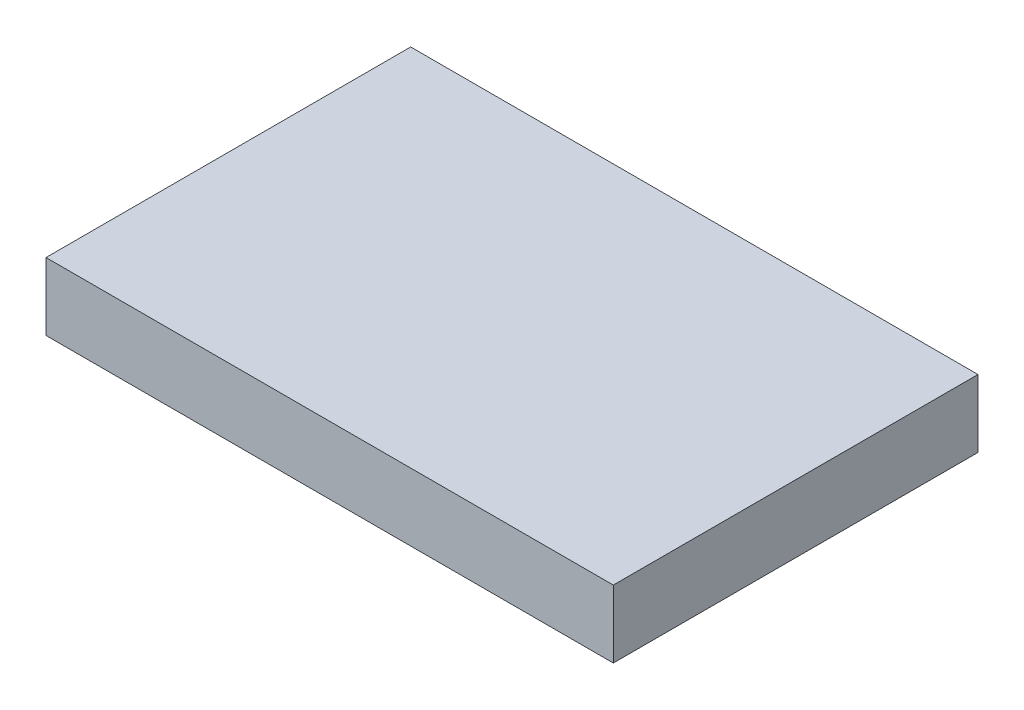
ISO-10303-21;
HEADER;
FILE_DESCRIPTION(('STEP AP214'),'2;1');
FILE_NAME('part.step','',(''),(''),'','','');
FILE_SCHEMA(('AUTOMOTIVE_DESIGN { 1 0 10303 214 1 1 1 1 }'));
ENDSEC;
DATA;
#1=APPLICATION_CONTEXT('core data for automotive mechanical design processes');
#2=APPLICATION_PROTOCOL_DEFINITION('international standard','automotive_design',2000,#1);
#3=PRODUCT_CONTEXT('',#1,'mechanical');
#4=PRODUCT('Part','Part','',(#3));
#5=PRODUCT_RELATED_PRODUCT_CATEGORY('part','',(#4));
#6=PRODUCT_DEFINITION_FORMATION('','',#4);
#7=PRODUCT_DEFINITION_CONTEXT('part definition',#1,'design');
#8=PRODUCT_DEFINITION('design','',#6,#7);
#9=PRODUCT_DEFINITION_SHAPE('','',#8);
#10=(LENGTH_UNIT() NAMED_UNIT(*) SI_UNIT(.MILLI.,.METRE.));
#11=(NAMED_UNIT(*) PLANE_ANGLE_UNIT() SI_UNIT($,.RADIAN.));
#12=(NAMED_UNIT(*) SI_UNIT($,.STERADIAN.) SOLID_ANGLE_UNIT());
#13=UNCERTAINTY_MEASURE_WITH_UNIT(LENGTH_MEASURE(1.E-05),#10,'distance_accuracy_value','');
#14=(GEOMETRIC_REPRESENTATION_CONTEXT(3) GLOBAL_UNCERTAINTY_ASSIGNED_CONTEXT((#13)) GLOBAL_UNIT_ASSIGNED_CONTEXT((#10,
#11,#12)) REPRESENTATION_CONTEXT('',''));
#15=CARTESIAN_POINT('',(0.,0.,0.));
#16=DIRECTION('',(0.,0.,1.));
#17=DIRECTION('',(1.,0.,0.));
#18=AXIS2_PLACEMENT_3D('',#15,#16,#17);
#19=CARTESIAN_POINT('',(42.,10.,27.));
#20=DIRECTION('',(-1.,0.,0.));
#21=DIRECTION('',(0.,0.,1.));
#22=AXIS2_PLACEMENT_3D('',#19,#20,#21);
#23=PLANE('',#22);
#24=DIRECTION('',(0.,0.,-1.));
#25=VECTOR('',#24,1.);
#26=CARTESIAN_POINT('',(42.,0.,27.));
#27=LINE('',#26,#25);
#28=CARTESIAN_POINT('',(42.,0.,27.));
#29=VERTEX_POINT('',#28);
#30=CARTESIAN_POINT('',(42.,0.,-27.));
#31=VERTEX_POINT('',#30);
#32=EDGE_CURVE('E97',#29,#31,#27,.T.);
#33=ORIENTED_EDGE('',*,*,#32,.T.);
#34=DIRECTION('',(0.,-1.,0.));
#35=VECTOR('',#34,1.);
#36=CARTESIAN_POINT('',(42.,10.,-27.));
#37=LINE('',#36,#35);
#38=CARTESIAN_POINT('',(42.,10.,-27.));
#39=VERTEX_POINT('',#38);
#40=EDGE_CURVE('E11',#39,#31,#37,.T.);
#41=ORIENTED_EDGE('',*,*,#40,.F.);
#42=DIRECTION('',(0.,0.,-1.));
#43=VECTOR('',#42,1.);
#44=CARTESIAN_POINT('',(42.,10.,27.));
#45=LINE('',#44,#43);
#46=CARTESIAN_POINT('',(42.,10.,27.));
#47=VERTEX_POINT('',#46);
#48=EDGE_CURVE('E85',#47,#39,#45,.T.);
#49=ORIENTED_EDGE('',*,*,#48,.F.);
#50=DIRECTION('',(0.,-1.,0.));
#51=VECTOR('',#50,1.);
#52=CARTESIAN_POINT('',(42.,10.,27.));
#53=LINE('',#52,#51);
#54=EDGE_CURVE('E93',#47,#29,#53,.T.);
#55=ORIENTED_EDGE('',*,*,#54,.T.);
#56=EDGE_LOOP('',(#33,#41,#49,#55));
#57=FACE_BOUND('',#56,.T.);
#58=ADVANCED_FACE('F34',(#57),#23,.F.);
#59=CARTESIAN_POINT('',(-42.,10.,-27.));
#60=DIRECTION('',(0.,0.,1.));
#61=DIRECTION('',(1.,0.,0.));
#62=AXIS2_PLACEMENT_3D('',#59,#60,#61);
#63=PLANE('',#62);
#64=DIRECTION('',(-1.,0.,0.));
#65=VECTOR('',#64,1.);
#66=CARTESIAN_POINT('',(-42.,0.,-27.));
#67=LINE('',#66,#65);
#68=CARTESIAN_POINT('',(-42.,0.,-27.));
#69=VERTEX_POINT('',#68);
#70=EDGE_CURVE('E89',#31,#69,#67,.T.);
#71=ORIENTED_EDGE('',*,*,#70,.T.);
#72=DIRECTION('',(0.,-1.,0.));
#73=VECTOR('',#72,1.);
#74=CARTESIAN_POINT('',(-42.,10.,-27.));
#75=LINE('',#74,#73);
#76=CARTESIAN_POINT('',(-42.,10.,-27.));
#77=VERTEX_POINT('',#76);
#78=EDGE_CURVE('E42',#77,#69,#75,.T.);
#79=ORIENTED_EDGE('',*,*,#78,.F.);
#80=DIRECTION('',(-1.,0.,0.));
#81=VECTOR('',#80,1.);
#82=CARTESIAN_POINT('',(-42.,10.,-27.));
#83=LINE('',#82,#81);
#84=EDGE_CURVE('E80',#39,#77,#83,.T.);
#85=ORIENTED_EDGE('',*,*,#84,.F.);
#86=ORIENTED_EDGE('',*,*,#40,.T.);
#87=EDGE_LOOP('',(#71,#79,#85,#86));
#88=FACE_BOUND('',#87,.T.);
#89=ADVANCED_FACE('F88',(#88),#63,.F.);
#90=CARTESIAN_POINT('',(-42.,10.,27.));
#91=DIRECTION('',(1.,0.,0.));
#92=DIRECTION('',(0.,0.,-1.));
#93=AXIS2_PLACEMENT_3D('',#90,#91,#92);
#94=PLANE('',#93);
#95=DIRECTION('',(0.,0.,1.));
#96=VECTOR('',#95,1.);
#97=CARTESIAN_POINT('',(-42.,0.,27.));
#98=LINE('',#97,#96);
#99=CARTESIAN_POINT('',(-42.,0.,27.));
#100=VERTEX_POINT('',#99);
#101=EDGE_CURVE('E67',#69,#100,#98,.T.);
#102=ORIENTED_EDGE('',*,*,#101,.T.);
#103=DIRECTION('',(0.,-1.,0.));
#104=VECTOR('',#103,1.);
#105=CARTESIAN_POINT('',(-42.,10.,27.));
#106=LINE('',#105,#104);
#107=CARTESIAN_POINT('',(-42.,10.,27.));
#108=VERTEX_POINT('',#107);
#109=EDGE_CURVE('E90',#108,#100,#106,.T.);
#110=ORIENTED_EDGE('',*,*,#109,.F.);
#111=DIRECTION('',(0.,0.,1.));
#112=VECTOR('',#111,1.);
#113=CARTESIAN_POINT('',(-42.,10.,27.));
#114=LINE('',#113,#112);
#115=EDGE_CURVE('E83',#77,#108,#114,.T.);
#116=ORIENTED_EDGE('',*,*,#115,.F.);
#117=ORIENTED_EDGE('',*,*,#78,.T.);
#118=EDGE_LOOP('',(#102,#110,#116,#117));
#119=FACE_BOUND('',#118,.T.);
#120=ADVANCED_FACE('F91',(#119),#94,.F.);
#121=CARTESIAN_POINT('',(-42.,10.,27.));
#122=DIRECTION('',(0.,0.,-1.));
#123=DIRECTION('',(-1.,0.,0.));
#124=AXIS2_PLACEMENT_3D('',#121,#122,#123);
#125=PLANE('',#124);
#126=DIRECTION('',(1.,0.,0.));
#127=VECTOR('',#126,1.);
#128=CARTESIAN_POINT('',(-42.,0.,27.));
#129=LINE('',#128,#127);
#130=EDGE_CURVE('E73',#100,#29,#129,.T.);
#131=ORIENTED_EDGE('',*,*,#130,.T.);
#132=ORIENTED_EDGE('',*,*,#54,.F.);
#133=DIRECTION('',(1.,0.,0.));
#134=VECTOR('',#133,1.);
#135=CARTESIAN_POINT('',(-42.,10.,27.));
#136=LINE('',#135,#134);
#137=EDGE_CURVE('E50',#108,#47,#136,.T.);
#138=ORIENTED_EDGE('',*,*,#137,.F.);
#139=ORIENTED_EDGE('',*,*,#109,.T.);
#140=EDGE_LOOP('',(#131,#132,#138,#139));
#141=FACE_BOUND('',#140,.T.);
#142=ADVANCED_FACE('F104',(#141),#125,.F.);
#143=CARTESIAN_POINT('',(0.,10.,0.));
#144=DIRECTION('',(0.,-1.,0.));
#145=DIRECTION('',(0.,0.,-1.));
#146=AXIS2_PLACEMENT_3D('',#143,#144,#145);
#147=PLANE('',#146);
#148=ORIENTED_EDGE('',*,*,#48,.T.);
#149=ORIENTED_EDGE('',*,*,#84,.T.);
#150=ORIENTED_EDGE('',*,*,#115,.T.);
#151=ORIENTED_EDGE('',*,*,#137,.T.);
#152=EDGE_LOOP('',(#148,#149,#150,#151));
#153=FACE_BOUND('',#152,.T.);
#154=ADVANCED_FACE('F81',(#153),#147,.F.);
#155=CARTESIAN_POINT('',(0.,0.,0.));
#156=DIRECTION('',(0.,-1.,0.));
#157=DIRECTION('',(0.,0.,-1.));
#158=AXIS2_PLACEMENT_3D('',#155,#156,#157);
#159=PLANE('',#158);
#160=ORIENTED_EDGE('',*,*,#32,.F.);
#161=ORIENTED_EDGE('',*,*,#130,.F.);
#162=ORIENTED_EDGE('',*,*,#101,.F.);
#163=ORIENTED_EDGE('',*,*,#70,.F.);
#164=EDGE_LOOP('',(#160,#161,#162,#163));
#165=FACE_BOUND('',#164,.T.);
#166=ADVANCED_FACE('F107',(#165),#159,.T.);
#167=CLOSED_SHELL('',(#58,#89,#120,#142,#154,#166));
#168=MANIFOLD_SOLID_BREP('B2',#167);
#169=ADVANCED_BREP_SHAPE_REPRESENTATION('',(#18,#168),#14);
#170=SHAPE_DEFINITION_REPRESENTATION(#9,#169);
ENDSEC;
END-ISO-10303-21;
